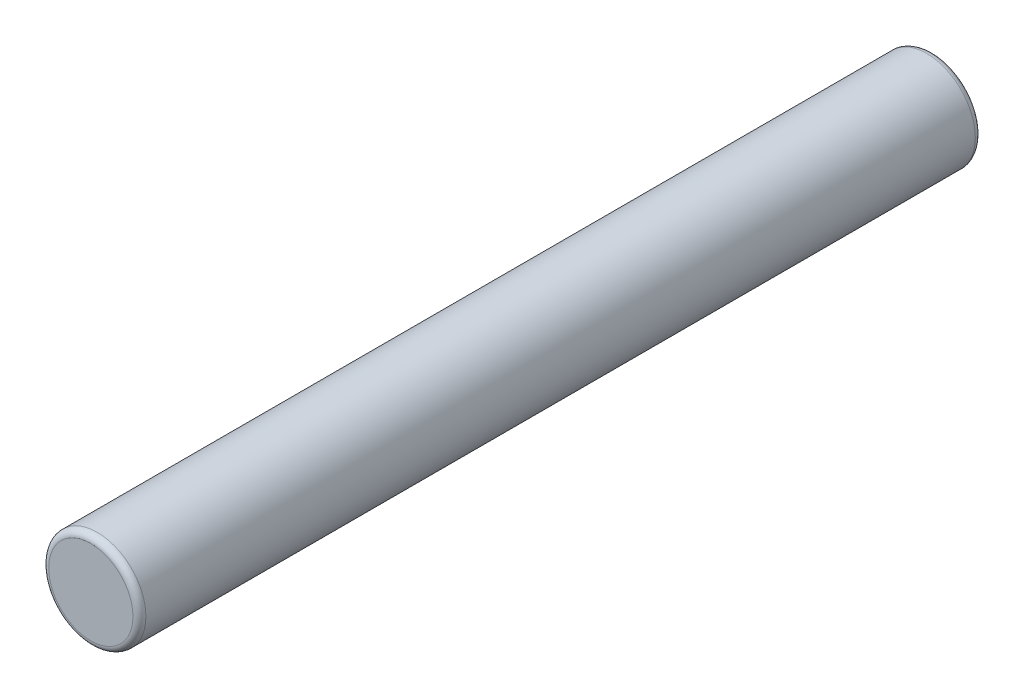
ISO-10303-21;
HEADER;
FILE_DESCRIPTION(('STEP AP214'),'2;1');
FILE_NAME('part.step','',(''),(''),'','','');
FILE_SCHEMA(('AUTOMOTIVE_DESIGN { 1 0 10303 214 1 1 1 1 }'));
ENDSEC;
DATA;
#1=APPLICATION_CONTEXT('core data for automotive mechanical design processes');
#2=APPLICATION_PROTOCOL_DEFINITION('international standard','automotive_design',2000,#1);
#3=PRODUCT_CONTEXT('',#1,'mechanical');
#4=PRODUCT('Part','Part','',(#3));
#5=PRODUCT_RELATED_PRODUCT_CATEGORY('part','',(#4));
#6=PRODUCT_DEFINITION_FORMATION('','',#4);
#7=PRODUCT_DEFINITION_CONTEXT('part definition',#1,'design');
#8=PRODUCT_DEFINITION('design','',#6,#7);
#9=PRODUCT_DEFINITION_SHAPE('','',#8);
#10=(LENGTH_UNIT() NAMED_UNIT(*) SI_UNIT(.MILLI.,.METRE.));
#11=(NAMED_UNIT(*) PLANE_ANGLE_UNIT() SI_UNIT($,.RADIAN.));
#12=(NAMED_UNIT(*) SI_UNIT($,.STERADIAN.) SOLID_ANGLE_UNIT());
#13=UNCERTAINTY_MEASURE_WITH_UNIT(LENGTH_MEASURE(1.E-05),#10,'distance_accuracy_value','');
#14=(GEOMETRIC_REPRESENTATION_CONTEXT(3) GLOBAL_UNCERTAINTY_ASSIGNED_CONTEXT((#13)) GLOBAL_UNIT_ASSIGNED_CONTEXT((#10,
#11,#12)) REPRESENTATION_CONTEXT('',''));
#15=CARTESIAN_POINT('',(0.,0.,0.));
#16=DIRECTION('',(0.,0.,1.));
#17=DIRECTION('',(1.,0.,0.));
#18=AXIS2_PLACEMENT_3D('',#15,#16,#17);
#19=CARTESIAN_POINT('',(0.,0.,26.));
#20=DIRECTION('',(0.,0.,-1.));
#21=DIRECTION('',(-1.,0.,0.));
#22=AXIS2_PLACEMENT_3D('',#19,#20,#21);
#23=CYLINDRICAL_SURFACE('',#22,1.5);
#24=CARTESIAN_POINT('',(0.,0.,0.199999999999999));
#25=DIRECTION('',(0.,0.,1.));
#26=DIRECTION('',(1.,0.,0.));
#27=AXIS2_PLACEMENT_3D('',#24,#25,#26);
#28=CIRCLE('',#27,1.5);
#29=CARTESIAN_POINT('',(-1.5,0.,0.199999999999999));
#30=VERTEX_POINT('',#29);
#31=EDGE_CURVE('E50',#30,#30,#28,.T.);
#32=CARTESIAN_POINT('',(0.,0.,25.8));
#33=DIRECTION('',(0.,0.,1.));
#34=DIRECTION('',(1.,0.,0.));
#35=AXIS2_PLACEMENT_3D('',#32,#33,#34);
#36=CIRCLE('',#35,1.5);
#37=CARTESIAN_POINT('',(-1.5,0.,25.8));
#38=VERTEX_POINT('',#37);
#39=EDGE_CURVE('E55',#38,#38,#36,.F.);
#40=CARTESIAN_POINT('',(-1.5,0.,0.199999999999999));
#41=CARTESIAN_POINT('',(-1.5,0.,0.466666666666665));
#42=CARTESIAN_POINT('',(-1.5,0.,0.733333333333331));
#43=CARTESIAN_POINT('',(-1.5,0.,1.26666666666666));
#44=CARTESIAN_POINT('',(-1.5,0.,1.53333333333333));
#45=CARTESIAN_POINT('',(-1.5,0.,2.06666666666667));
#46=CARTESIAN_POINT('',(-1.5,0.,2.33333333333333));
#47=CARTESIAN_POINT('',(-1.5,0.,2.86666666666667));
#48=CARTESIAN_POINT('',(-1.5,0.,3.13333333333333));
#49=CARTESIAN_POINT('',(-1.5,0.,3.66666666666667));
#50=CARTESIAN_POINT('',(-1.5,0.,3.93333333333333));
#51=CARTESIAN_POINT('',(-1.5,0.,4.46666666666667));
#52=CARTESIAN_POINT('',(-1.5,0.,4.73333333333333));
#53=CARTESIAN_POINT('',(-1.5,0.,5.26666666666666));
#54=CARTESIAN_POINT('',(-1.5,0.,5.53333333333333));
#55=CARTESIAN_POINT('',(-1.5,0.,6.06666666666667));
#56=CARTESIAN_POINT('',(-1.5,0.,6.33333333333333));
#57=CARTESIAN_POINT('',(-1.5,0.,6.86666666666667));
#58=CARTESIAN_POINT('',(-1.5,0.,7.13333333333333));
#59=CARTESIAN_POINT('',(-1.5,0.,7.66666666666667));
#60=CARTESIAN_POINT('',(-1.5,0.,7.93333333333333));
#61=CARTESIAN_POINT('',(-1.5,0.,8.46666666666667));
#62=CARTESIAN_POINT('',(-1.5,0.,8.73333333333333));
#63=CARTESIAN_POINT('',(-1.5,0.,9.26666666666667));
#64=CARTESIAN_POINT('',(-1.5,0.,9.53333333333333));
#65=CARTESIAN_POINT('',(-1.5,0.,10.0666666666667));
#66=CARTESIAN_POINT('',(-1.5,0.,10.3333333333333));
#67=CARTESIAN_POINT('',(-1.5,0.,10.8666666666667));
#68=CARTESIAN_POINT('',(-1.5,0.,11.1333333333333));
#69=CARTESIAN_POINT('',(-1.5,0.,11.6666666666667));
#70=CARTESIAN_POINT('',(-1.5,0.,11.9333333333333));
#71=CARTESIAN_POINT('',(-1.5,0.,12.4666666666667));
#72=CARTESIAN_POINT('',(-1.5,0.,12.7333333333333));
#73=CARTESIAN_POINT('',(-1.5,0.,13.2666666666667));
#74=CARTESIAN_POINT('',(-1.5,0.,13.5333333333333));
#75=CARTESIAN_POINT('',(-1.5,0.,14.0666666666667));
#76=CARTESIAN_POINT('',(-1.5,0.,14.3333333333333));
#77=CARTESIAN_POINT('',(-1.5,0.,14.8666666666667));
#78=CARTESIAN_POINT('',(-1.5,0.,15.1333333333333));
#79=CARTESIAN_POINT('',(-1.5,0.,15.6666666666667));
#80=CARTESIAN_POINT('',(-1.5,0.,15.9333333333333));
#81=CARTESIAN_POINT('',(-1.5,0.,16.4666666666667));
#82=CARTESIAN_POINT('',(-1.5,0.,16.7333333333333));
#83=CARTESIAN_POINT('',(-1.5,0.,17.2666666666667));
#84=CARTESIAN_POINT('',(-1.5,0.,17.5333333333333));
#85=CARTESIAN_POINT('',(-1.5,0.,18.0666666666667));
#86=CARTESIAN_POINT('',(-1.5,0.,18.3333333333333));
#87=CARTESIAN_POINT('',(-1.5,0.,18.8666666666667));
#88=CARTESIAN_POINT('',(-1.5,0.,19.1333333333333));
#89=CARTESIAN_POINT('',(-1.5,0.,19.6666666666667));
#90=CARTESIAN_POINT('',(-1.5,0.,19.9333333333333));
#91=CARTESIAN_POINT('',(-1.5,0.,20.4666666666667));
#92=CARTESIAN_POINT('',(-1.5,0.,20.7333333333333));
#93=CARTESIAN_POINT('',(-1.5,0.,21.2666666666667));
#94=CARTESIAN_POINT('',(-1.5,0.,21.5333333333333));
#95=CARTESIAN_POINT('',(-1.5,0.,22.0666666666667));
#96=CARTESIAN_POINT('',(-1.5,0.,22.3333333333333));
#97=CARTESIAN_POINT('',(-1.5,0.,22.8666666666667));
#98=CARTESIAN_POINT('',(-1.5,0.,23.1333333333333));
#99=CARTESIAN_POINT('',(-1.5,0.,23.6666666666667));
#100=CARTESIAN_POINT('',(-1.5,0.,23.9333333333333));
#101=CARTESIAN_POINT('',(-1.5,0.,24.4666666666667));
#102=CARTESIAN_POINT('',(-1.5,0.,24.7333333333333));
#103=CARTESIAN_POINT('',(-1.5,0.,25.2666666666667));
#104=CARTESIAN_POINT('',(-1.5,0.,25.5333333333333));
#105=CARTESIAN_POINT('',(-1.5,0.,25.8));
#106=B_SPLINE_CURVE_WITH_KNOTS('',3,(#40,#41,#42,#43,#44,#45,#46,#47,#48,#49,#50,#51,#52,#53,
#54,#55,#56,#57,#58,#59,#60,#61,#62,#63,#64,#65,#66,#67,#68,#69,#70,#71,#72,#73,#74,#75,#76,#77,
#78,#79,#80,#81,#82,#83,#84,#85,#86,#87,#88,#89,#90,#91,#92,#93,#94,#95,#96,#97,#98,#99,#100,
#101,#102,#103,#104,#105),.UNSPECIFIED.,.F.,.F.,(4,2,2,2,2,2,2,2,2,2,2,2,2,2,2,2,2,2,2,2,2,2,2,
2,2,2,2,2,2,2,2,2,4),(0.,0.799999999999999,1.6,2.4,3.2,4.,4.8,5.6,6.4,7.2,8.,8.8,9.6,10.4,11.2,
12.,12.8,13.6,14.4,15.2,16.,16.8,17.6,18.4,19.2,20.,20.8,21.6,22.4,23.2,24.,24.8,25.6),.UNSPECIFIED.);
#107=EDGE_CURVE('BSEAM37',#30,#38,#106,.T.);
#108=ORIENTED_EDGE('',*,*,#31,.T.);
#109=ORIENTED_EDGE('',*,*,#39,.T.);
#110=ORIENTED_EDGE('',*,*,#107,.T.);
#111=ORIENTED_EDGE('',*,*,#107,.F.);
#112=EDGE_LOOP('',(#108,#110,#109,#111));
#113=FACE_BOUND('',#112,.T.);
#114=ADVANCED_FACE('F37',(#113),#23,.T.);
#115=CARTESIAN_POINT('',(0.,0.,26.));
#116=DIRECTION('',(0.,0.,1.));
#117=DIRECTION('',(1.,0.,0.));
#118=AXIS2_PLACEMENT_3D('',#115,#116,#117);
#119=PLANE('',#118);
#120=CARTESIAN_POINT('',(0.,0.,26.));
#121=DIRECTION('',(0.,0.,1.));
#122=DIRECTION('',(1.,0.,0.));
#123=AXIS2_PLACEMENT_3D('',#120,#121,#122);
#124=CIRCLE('',#123,1.3);
#125=CARTESIAN_POINT('',(1.3,0.,26.));
#126=VERTEX_POINT('',#125);
#127=EDGE_CURVE('E10',#126,#126,#124,.T.);
#128=ORIENTED_EDGE('',*,*,#127,.T.);
#129=EDGE_LOOP('',(#128));
#130=FACE_BOUND('',#129,.T.);
#131=ADVANCED_FACE('F72',(#130),#119,.T.);
#132=CARTESIAN_POINT('',(0.,0.,0.));
#133=DIRECTION('',(0.,0.,1.));
#134=DIRECTION('',(1.,0.,0.));
#135=AXIS2_PLACEMENT_3D('',#132,#133,#134);
#136=PLANE('',#135);
#137=CARTESIAN_POINT('',(0.,0.,0.));
#138=DIRECTION('',(0.,0.,1.));
#139=DIRECTION('',(1.,0.,0.));
#140=AXIS2_PLACEMENT_3D('',#137,#138,#139);
#141=CIRCLE('',#140,1.3);
#142=CARTESIAN_POINT('',(1.3,0.,0.));
#143=VERTEX_POINT('',#142);
#144=EDGE_CURVE('E45',#143,#143,#141,.F.);
#145=ORIENTED_EDGE('',*,*,#144,.T.);
#146=EDGE_LOOP('',(#145));
#147=FACE_BOUND('',#146,.T.);
#148=ADVANCED_FACE('F69',(#147),#136,.F.);
#149=CARTESIAN_POINT('',(0.,0.,0.199999999999999));
#150=DIRECTION('',(0.,0.,1.));
#151=DIRECTION('',(1.,0.,0.));
#152=AXIS2_PLACEMENT_3D('',#149,#150,#151);
#153=TOROIDAL_SURFACE('',#152,1.3,0.2);
#154=ORIENTED_EDGE('',*,*,#144,.F.);
#155=EDGE_LOOP('',(#154));
#156=FACE_BOUND('',#155,.T.);
#157=ORIENTED_EDGE('',*,*,#31,.F.);
#158=EDGE_LOOP('',(#157));
#159=FACE_BOUND('',#158,.T.);
#160=ADVANCED_FACE('F65',(#156,#159),#153,.T.);
#161=CARTESIAN_POINT('',(0.,0.,25.8));
#162=DIRECTION('',(0.,0.,1.));
#163=DIRECTION('',(1.,0.,0.));
#164=AXIS2_PLACEMENT_3D('',#161,#162,#163);
#165=TOROIDAL_SURFACE('',#164,1.3,0.2);
#166=ORIENTED_EDGE('',*,*,#39,.F.);
#167=EDGE_LOOP('',(#166));
#168=FACE_BOUND('',#167,.T.);
#169=ORIENTED_EDGE('',*,*,#127,.F.);
#170=EDGE_LOOP('',(#169));
#171=FACE_BOUND('',#170,.T.);
#172=ADVANCED_FACE('F39',(#168,#171),#165,.T.);
#173=CLOSED_SHELL('',(#114,#131,#148,#160,#172));
#174=MANIFOLD_SOLID_BREP('B2',#173);
#175=ADVANCED_BREP_SHAPE_REPRESENTATION('',(#18,#174),#14);
#176=SHAPE_DEFINITION_REPRESENTATION(#9,#175);
ENDSEC;
END-ISO-10303-21;
